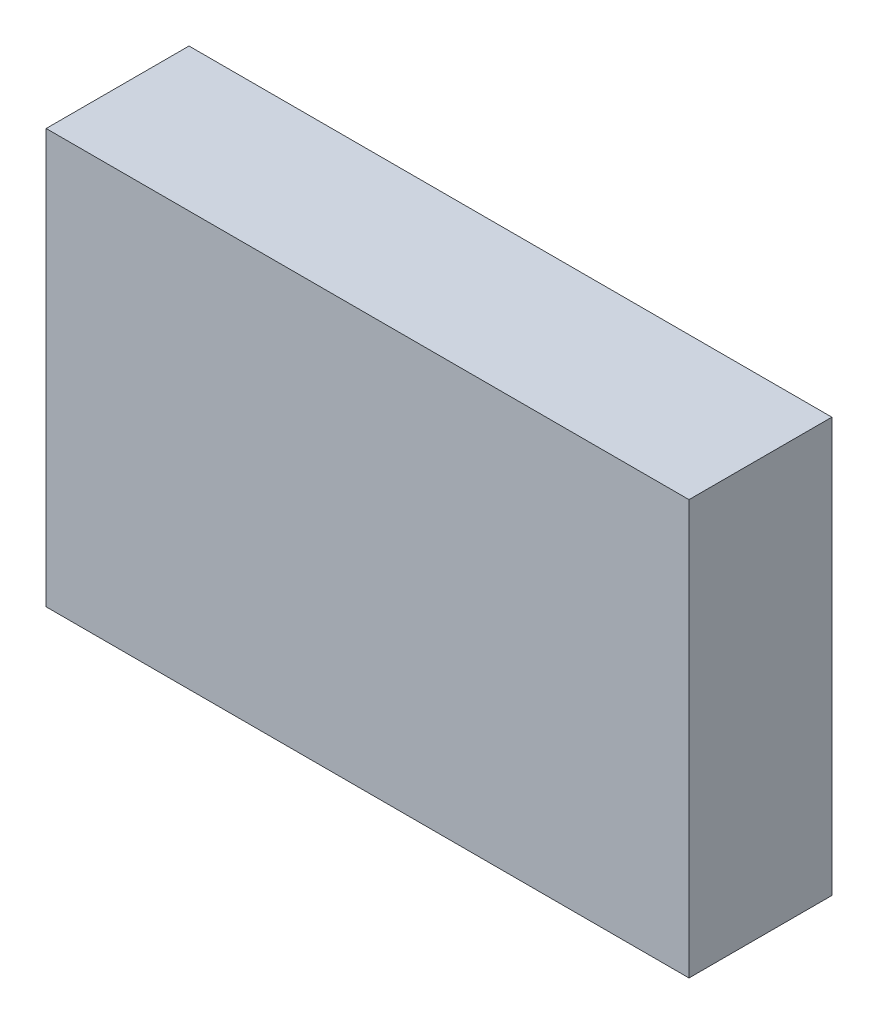
ISO-10303-21;
HEADER;
FILE_DESCRIPTION(('STEP AP214'),'2;1');
FILE_NAME('part.step','',(''),(''),'','','');
FILE_SCHEMA(('AUTOMOTIVE_DESIGN { 1 0 10303 214 1 1 1 1 }'));
ENDSEC;
DATA;
#1=APPLICATION_CONTEXT('core data for automotive mechanical design processes');
#2=APPLICATION_PROTOCOL_DEFINITION('international standard','automotive_design',2000,#1);
#3=PRODUCT_CONTEXT('',#1,'mechanical');
#4=PRODUCT('Part','Part','',(#3));
#5=PRODUCT_RELATED_PRODUCT_CATEGORY('part','',(#4));
#6=PRODUCT_DEFINITION_FORMATION('','',#4);
#7=PRODUCT_DEFINITION_CONTEXT('part definition',#1,'design');
#8=PRODUCT_DEFINITION('design','',#6,#7);
#9=PRODUCT_DEFINITION_SHAPE('','',#8);
#10=(LENGTH_UNIT() NAMED_UNIT(*) SI_UNIT(.MILLI.,.METRE.));
#11=(NAMED_UNIT(*) PLANE_ANGLE_UNIT() SI_UNIT($,.RADIAN.));
#12=(NAMED_UNIT(*) SI_UNIT($,.STERADIAN.) SOLID_ANGLE_UNIT());
#13=UNCERTAINTY_MEASURE_WITH_UNIT(LENGTH_MEASURE(1.E-05),#10,'distance_accuracy_value','');
#14=(GEOMETRIC_REPRESENTATION_CONTEXT(3) GLOBAL_UNCERTAINTY_ASSIGNED_CONTEXT((#13)) GLOBAL_UNIT_ASSIGNED_CONTEXT((#10,
#11,#12)) REPRESENTATION_CONTEXT('',''));
#15=CARTESIAN_POINT('',(0.,0.,0.));
#16=DIRECTION('',(0.,0.,1.));
#17=DIRECTION('',(1.,0.,0.));
#18=AXIS2_PLACEMENT_3D('',#15,#16,#17);
#19=CARTESIAN_POINT('',(22.5,14.5,10.));
#20=DIRECTION('',(-1.,0.,0.));
#21=DIRECTION('',(0.,-1.,0.));
#22=AXIS2_PLACEMENT_3D('',#19,#20,#21);
#23=PLANE('',#22);
#24=DIRECTION('',(0.,1.,0.));
#25=VECTOR('',#24,1.);
#26=CARTESIAN_POINT('',(22.5,14.5,0.));
#27=LINE('',#26,#25);
#28=CARTESIAN_POINT('',(22.5,-14.5,0.));
#29=VERTEX_POINT('',#28);
#30=CARTESIAN_POINT('',(22.5,14.5,0.));
#31=VERTEX_POINT('',#30);
#32=EDGE_CURVE('E96',#29,#31,#27,.T.);
#33=ORIENTED_EDGE('',*,*,#32,.T.);
#34=DIRECTION('',(0.,0.,-1.));
#35=VECTOR('',#34,1.);
#36=CARTESIAN_POINT('',(22.5,14.5,10.));
#37=LINE('',#36,#35);
#38=CARTESIAN_POINT('',(22.5,14.5,10.));
#39=VERTEX_POINT('',#38);
#40=EDGE_CURVE('E11',#39,#31,#37,.T.);
#41=ORIENTED_EDGE('',*,*,#40,.F.);
#42=DIRECTION('',(0.,1.,0.));
#43=VECTOR('',#42,1.);
#44=CARTESIAN_POINT('',(22.5,14.5,10.));
#45=LINE('',#44,#43);
#46=CARTESIAN_POINT('',(22.5,-14.5,10.));
#47=VERTEX_POINT('',#46);
#48=EDGE_CURVE('E84',#47,#39,#45,.T.);
#49=ORIENTED_EDGE('',*,*,#48,.F.);
#50=DIRECTION('',(0.,0.,-1.));
#51=VECTOR('',#50,1.);
#52=CARTESIAN_POINT('',(22.5,-14.5,10.));
#53=LINE('',#52,#51);
#54=EDGE_CURVE('E92',#47,#29,#53,.T.);
#55=ORIENTED_EDGE('',*,*,#54,.T.);
#56=EDGE_LOOP('',(#33,#41,#49,#55));
#57=FACE_BOUND('',#56,.T.);
#58=ADVANCED_FACE('F33',(#57),#23,.F.);
#59=CARTESIAN_POINT('',(-22.5,14.5,10.));
#60=DIRECTION('',(0.,-1.,0.));
#61=DIRECTION('',(0.,0.,-1.));
#62=AXIS2_PLACEMENT_3D('',#59,#60,#61);
#63=PLANE('',#62);
#64=DIRECTION('',(-1.,0.,0.));
#65=VECTOR('',#64,1.);
#66=CARTESIAN_POINT('',(-22.5,14.5,0.));
#67=LINE('',#66,#65);
#68=CARTESIAN_POINT('',(-22.5,14.5,0.));
#69=VERTEX_POINT('',#68);
#70=EDGE_CURVE('E88',#31,#69,#67,.T.);
#71=ORIENTED_EDGE('',*,*,#70,.T.);
#72=DIRECTION('',(0.,0.,-1.));
#73=VECTOR('',#72,1.);
#74=CARTESIAN_POINT('',(-22.5,14.5,10.));
#75=LINE('',#74,#73);
#76=CARTESIAN_POINT('',(-22.5,14.5,10.));
#77=VERTEX_POINT('',#76);
#78=EDGE_CURVE('E41',#77,#69,#75,.T.);
#79=ORIENTED_EDGE('',*,*,#78,.F.);
#80=DIRECTION('',(-1.,0.,0.));
#81=VECTOR('',#80,1.);
#82=CARTESIAN_POINT('',(-22.5,14.5,10.));
#83=LINE('',#82,#81);
#84=EDGE_CURVE('E79',#39,#77,#83,.T.);
#85=ORIENTED_EDGE('',*,*,#84,.F.);
#86=ORIENTED_EDGE('',*,*,#40,.T.);
#87=EDGE_LOOP('',(#71,#79,#85,#86));
#88=FACE_BOUND('',#87,.T.);
#89=ADVANCED_FACE('F87',(#88),#63,.F.);
#90=CARTESIAN_POINT('',(-22.5,14.5,10.));
#91=DIRECTION('',(1.,0.,0.));
#92=DIRECTION('',(0.,1.,0.));
#93=AXIS2_PLACEMENT_3D('',#90,#91,#92);
#94=PLANE('',#93);
#95=DIRECTION('',(0.,-1.,0.));
#96=VECTOR('',#95,1.);
#97=CARTESIAN_POINT('',(-22.5,14.5,0.));
#98=LINE('',#97,#96);
#99=CARTESIAN_POINT('',(-22.5,-14.5,0.));
#100=VERTEX_POINT('',#99);
#101=EDGE_CURVE('E66',#69,#100,#98,.T.);
#102=ORIENTED_EDGE('',*,*,#101,.T.);
#103=DIRECTION('',(0.,0.,-1.));
#104=VECTOR('',#103,1.);
#105=CARTESIAN_POINT('',(-22.5,-14.5,10.));
#106=LINE('',#105,#104);
#107=CARTESIAN_POINT('',(-22.5,-14.5,10.));
#108=VERTEX_POINT('',#107);
#109=EDGE_CURVE('E89',#108,#100,#106,.T.);
#110=ORIENTED_EDGE('',*,*,#109,.F.);
#111=DIRECTION('',(0.,-1.,0.));
#112=VECTOR('',#111,1.);
#113=CARTESIAN_POINT('',(-22.5,14.5,10.));
#114=LINE('',#113,#112);
#115=EDGE_CURVE('E82',#77,#108,#114,.T.);
#116=ORIENTED_EDGE('',*,*,#115,.F.);
#117=ORIENTED_EDGE('',*,*,#78,.T.);
#118=EDGE_LOOP('',(#102,#110,#116,#117));
#119=FACE_BOUND('',#118,.T.);
#120=ADVANCED_FACE('F90',(#119),#94,.F.);
#121=CARTESIAN_POINT('',(-22.5,-14.5,10.));
#122=DIRECTION('',(0.,1.,0.));
#123=DIRECTION('',(0.,0.,1.));
#124=AXIS2_PLACEMENT_3D('',#121,#122,#123);
#125=PLANE('',#124);
#126=DIRECTION('',(1.,0.,0.));
#127=VECTOR('',#126,1.);
#128=CARTESIAN_POINT('',(-22.5,-14.5,0.));
#129=LINE('',#128,#127);
#130=EDGE_CURVE('E72',#100,#29,#129,.T.);
#131=ORIENTED_EDGE('',*,*,#130,.T.);
#132=ORIENTED_EDGE('',*,*,#54,.F.);
#133=DIRECTION('',(1.,0.,0.));
#134=VECTOR('',#133,1.);
#135=CARTESIAN_POINT('',(-22.5,-14.5,10.));
#136=LINE('',#135,#134);
#137=EDGE_CURVE('E49',#108,#47,#136,.T.);
#138=ORIENTED_EDGE('',*,*,#137,.F.);
#139=ORIENTED_EDGE('',*,*,#109,.T.);
#140=EDGE_LOOP('',(#131,#132,#138,#139));
#141=FACE_BOUND('',#140,.T.);
#142=ADVANCED_FACE('F103',(#141),#125,.F.);
#143=CARTESIAN_POINT('',(0.,0.,10.));
#144=DIRECTION('',(0.,0.,1.));
#145=DIRECTION('',(1.,0.,0.));
#146=AXIS2_PLACEMENT_3D('',#143,#144,#145);
#147=PLANE('',#146);
#148=ORIENTED_EDGE('',*,*,#48,.T.);
#149=ORIENTED_EDGE('',*,*,#84,.T.);
#150=ORIENTED_EDGE('',*,*,#115,.T.);
#151=ORIENTED_EDGE('',*,*,#137,.T.);
#152=EDGE_LOOP('',(#148,#149,#150,#151));
#153=FACE_BOUND('',#152,.T.);
#154=ADVANCED_FACE('F80',(#153),#147,.T.);
#155=CARTESIAN_POINT('',(0.,0.,0.));
#156=DIRECTION('',(0.,0.,1.));
#157=DIRECTION('',(1.,0.,0.));
#158=AXIS2_PLACEMENT_3D('',#155,#156,#157);
#159=PLANE('',#158);
#160=ORIENTED_EDGE('',*,*,#32,.F.);
#161=ORIENTED_EDGE('',*,*,#130,.F.);
#162=ORIENTED_EDGE('',*,*,#101,.F.);
#163=ORIENTED_EDGE('',*,*,#70,.F.);
#164=EDGE_LOOP('',(#160,#161,#162,#163));
#165=FACE_BOUND('',#164,.T.);
#166=ADVANCED_FACE('F106',(#165),#159,.F.);
#167=CLOSED_SHELL('',(#58,#89,#120,#142,#154,#166));
#168=MANIFOLD_SOLID_BREP('B2',#167);
#169=ADVANCED_BREP_SHAPE_REPRESENTATION('',(#18,#168),#14);
#170=SHAPE_DEFINITION_REPRESENTATION(#9,#169);
ENDSEC;
END-ISO-10303-21;
